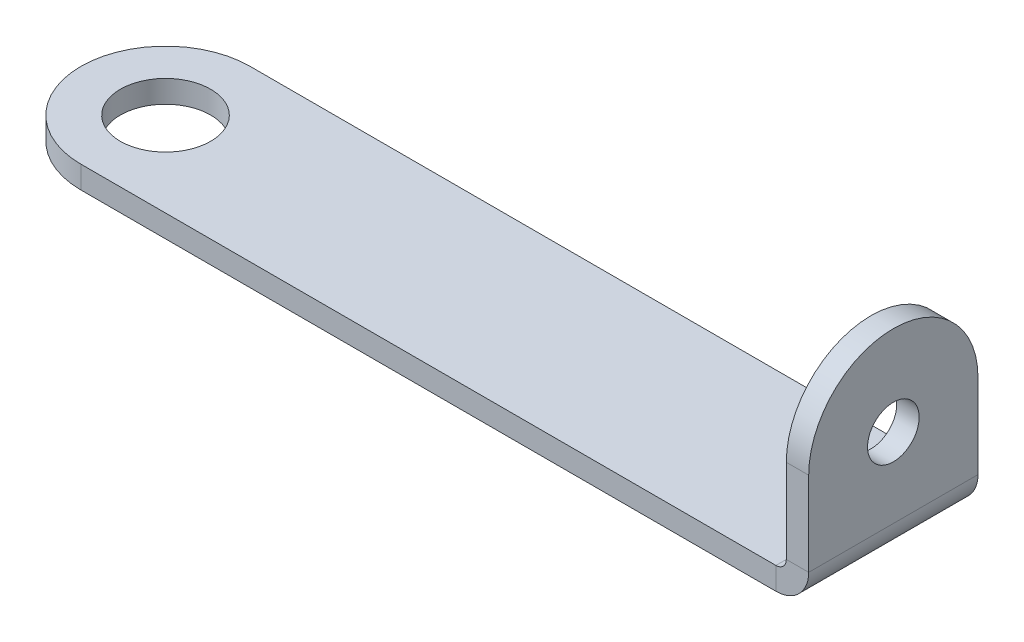
ISO-10303-21;
HEADER;
FILE_DESCRIPTION(('STEP AP214'),'2;1');
FILE_NAME('part.step','',(''),(''),'','','');
FILE_SCHEMA(('AUTOMOTIVE_DESIGN { 1 0 10303 214 1 1 1 1 }'));
ENDSEC;
DATA;
#1=APPLICATION_CONTEXT('core data for automotive mechanical design processes');
#2=APPLICATION_PROTOCOL_DEFINITION('international standard','automotive_design',2000,#1);
#3=PRODUCT_CONTEXT('',#1,'mechanical');
#4=PRODUCT('Part','Part','',(#3));
#5=PRODUCT_RELATED_PRODUCT_CATEGORY('part','',(#4));
#6=PRODUCT_DEFINITION_FORMATION('','',#4);
#7=PRODUCT_DEFINITION_CONTEXT('part definition',#1,'design');
#8=PRODUCT_DEFINITION('design','',#6,#7);
#9=PRODUCT_DEFINITION_SHAPE('','',#8);
#10=(LENGTH_UNIT() NAMED_UNIT(*) SI_UNIT(.MILLI.,.METRE.));
#11=(NAMED_UNIT(*) PLANE_ANGLE_UNIT() SI_UNIT($,.RADIAN.));
#12=(NAMED_UNIT(*) SI_UNIT($,.STERADIAN.) SOLID_ANGLE_UNIT());
#13=UNCERTAINTY_MEASURE_WITH_UNIT(LENGTH_MEASURE(1.E-05),#10,'distance_accuracy_value','');
#14=(GEOMETRIC_REPRESENTATION_CONTEXT(3) GLOBAL_UNCERTAINTY_ASSIGNED_CONTEXT((#13)) GLOBAL_UNIT_ASSIGNED_CONTEXT((#10,
#11,#12)) REPRESENTATION_CONTEXT('',''));
#15=CARTESIAN_POINT('',(0.,0.,0.));
#16=DIRECTION('',(0.,0.,1.));
#17=DIRECTION('',(1.,0.,0.));
#18=AXIS2_PLACEMENT_3D('',#15,#16,#17);
#19=CARTESIAN_POINT('',(51.5875,8.28749999999999,0.));
#20=DIRECTION('',(-1.,0.,0.));
#21=DIRECTION('',(0.,-1.,0.));
#22=AXIS2_PLACEMENT_3D('',#19,#20,#21);
#23=CYLINDRICAL_SURFACE('',#22,6.);
#24=DIRECTION('',(-1.,0.,0.));
#25=VECTOR('',#24,1.);
#26=CARTESIAN_POINT('',(51.5875,8.28749999999999,6.));
#27=LINE('',#26,#25);
#28=CARTESIAN_POINT('',(51.5875,8.28749999999999,6.));
#29=VERTEX_POINT('',#28);
#30=CARTESIAN_POINT('',(50.,8.2875,6.));
#31=VERTEX_POINT('',#30);
#32=EDGE_CURVE('E188',#29,#31,#27,.T.);
#33=ORIENTED_EDGE('',*,*,#32,.F.);
#34=CARTESIAN_POINT('',(51.5875,8.28749999999999,0.));
#35=DIRECTION('',(-1.,0.,0.));
#36=DIRECTION('',(0.,-1.,0.));
#37=AXIS2_PLACEMENT_3D('',#34,#35,#36);
#38=CIRCLE('',#37,6.);
#39=CARTESIAN_POINT('',(51.5875,8.28749999999999,-6.));
#40=VERTEX_POINT('',#39);
#41=EDGE_CURVE('E49',#40,#29,#38,.F.);
#42=ORIENTED_EDGE('',*,*,#41,.F.);
#43=DIRECTION('',(-1.,0.,0.));
#44=VECTOR('',#43,1.);
#45=CARTESIAN_POINT('',(51.5875,8.28749999999999,-6.));
#46=LINE('',#45,#44);
#47=CARTESIAN_POINT('',(50.,8.2875,-6.));
#48=VERTEX_POINT('',#47);
#49=EDGE_CURVE('E137',#48,#40,#46,.F.);
#50=ORIENTED_EDGE('',*,*,#49,.F.);
#51=CARTESIAN_POINT('',(50.,8.2875,0.));
#52=DIRECTION('',(-1.,0.,0.));
#53=DIRECTION('',(0.,-1.,0.));
#54=AXIS2_PLACEMENT_3D('',#51,#52,#53);
#55=CIRCLE('',#54,6.);
#56=EDGE_CURVE('E11',#31,#48,#55,.T.);
#57=ORIENTED_EDGE('',*,*,#56,.F.);
#58=EDGE_LOOP('',(#33,#42,#50,#57));
#59=FACE_BOUND('',#58,.T.);
#60=ADVANCED_FACE('F41',(#59),#23,.T.);
#61=CARTESIAN_POINT('',(0.,1.5875,0.));
#62=DIRECTION('',(0.,1.,0.));
#63=DIRECTION('',(0.,0.,1.));
#64=AXIS2_PLACEMENT_3D('',#61,#62,#63);
#65=PLANE('',#64);
#66=CARTESIAN_POINT('',(0.,1.5875,0.));
#67=DIRECTION('',(0.,1.,0.));
#68=DIRECTION('',(0.,0.,1.));
#69=AXIS2_PLACEMENT_3D('',#66,#67,#68);
#70=CIRCLE('',#69,3.19999999999999);
#71=CARTESIAN_POINT('',(0.,1.5875,3.19999999999999));
#72=VERTEX_POINT('',#71);
#73=EDGE_CURVE('E161',#72,#72,#70,.T.);
#74=ORIENTED_EDGE('',*,*,#73,.F.);
#75=EDGE_LOOP('',(#74));
#76=FACE_BOUND('',#75,.T.);
#77=DIRECTION('',(1.,0.,0.));
#78=VECTOR('',#77,1.);
#79=CARTESIAN_POINT('',(0.,1.5875,6.));
#80=LINE('',#79,#78);
#81=CARTESIAN_POINT('',(0.,1.5875,6.));
#82=VERTEX_POINT('',#81);
#83=CARTESIAN_POINT('',(49.2634,1.5875,6.));
#84=VERTEX_POINT('',#83);
#85=EDGE_CURVE('E170',#82,#84,#80,.T.);
#86=ORIENTED_EDGE('',*,*,#85,.T.);
#87=DIRECTION('',(0.,0.,-1.));
#88=VECTOR('',#87,1.);
#89=CARTESIAN_POINT('',(49.2634,1.5875,-6.));
#90=LINE('',#89,#88);
#91=CARTESIAN_POINT('',(49.2634,1.5875,-6.));
#92=VERTEX_POINT('',#91);
#93=EDGE_CURVE('E151',#92,#84,#90,.F.);
#94=ORIENTED_EDGE('',*,*,#93,.F.);
#95=DIRECTION('',(-1.,0.,0.));
#96=VECTOR('',#95,1.);
#97=CARTESIAN_POINT('',(0.,1.5875,-6.));
#98=LINE('',#97,#96);
#99=CARTESIAN_POINT('',(0.,1.5875,-6.));
#100=VERTEX_POINT('',#99);
#101=EDGE_CURVE('E174',#92,#100,#98,.T.);
#102=ORIENTED_EDGE('',*,*,#101,.T.);
#103=CARTESIAN_POINT('',(0.,1.5875,0.));
#104=DIRECTION('',(0.,1.,0.));
#105=DIRECTION('',(0.,0.,1.));
#106=AXIS2_PLACEMENT_3D('',#103,#104,#105);
#107=CIRCLE('',#106,6.);
#108=EDGE_CURVE('E167',#100,#82,#107,.T.);
#109=ORIENTED_EDGE('',*,*,#108,.T.);
#110=EDGE_LOOP('',(#86,#94,#102,#109));
#111=FACE_BOUND('',#110,.T.);
#112=ADVANCED_FACE('F220',(#76,#111),#65,.T.);
#113=CARTESIAN_POINT('',(0.,0.,0.));
#114=DIRECTION('',(0.,1.,0.));
#115=DIRECTION('',(0.,0.,1.));
#116=AXIS2_PLACEMENT_3D('',#113,#114,#115);
#117=PLANE('',#116);
#118=CARTESIAN_POINT('',(0.,0.,0.));
#119=DIRECTION('',(0.,1.,0.));
#120=DIRECTION('',(0.,0.,1.));
#121=AXIS2_PLACEMENT_3D('',#118,#119,#120);
#122=CIRCLE('',#121,3.19999999999999);
#123=CARTESIAN_POINT('',(0.,0.,3.19999999999999));
#124=VERTEX_POINT('',#123);
#125=EDGE_CURVE('E158',#124,#124,#122,.T.);
#126=ORIENTED_EDGE('',*,*,#125,.T.);
#127=EDGE_LOOP('',(#126));
#128=FACE_BOUND('',#127,.T.);
#129=DIRECTION('',(0.,0.,-1.));
#130=VECTOR('',#129,1.);
#131=CARTESIAN_POINT('',(49.2634,0.,-6.));
#132=LINE('',#131,#130);
#133=CARTESIAN_POINT('',(49.2634,0.,-6.));
#134=VERTEX_POINT('',#133);
#135=CARTESIAN_POINT('',(49.2634,0.,6.));
#136=VERTEX_POINT('',#135);
#137=EDGE_CURVE('E112',#134,#136,#132,.F.);
#138=ORIENTED_EDGE('',*,*,#137,.T.);
#139=DIRECTION('',(1.,0.,0.));
#140=VECTOR('',#139,1.);
#141=CARTESIAN_POINT('',(0.,0.,6.));
#142=LINE('',#141,#140);
#143=CARTESIAN_POINT('',(0.,0.,6.));
#144=VERTEX_POINT('',#143);
#145=EDGE_CURVE('E179',#144,#136,#142,.T.);
#146=ORIENTED_EDGE('',*,*,#145,.F.);
#147=CARTESIAN_POINT('',(0.,0.,0.));
#148=DIRECTION('',(0.,1.,0.));
#149=DIRECTION('',(0.,0.,1.));
#150=AXIS2_PLACEMENT_3D('',#147,#148,#149);
#151=CIRCLE('',#150,6.);
#152=CARTESIAN_POINT('',(0.,0.,-6.));
#153=VERTEX_POINT('',#152);
#154=EDGE_CURVE('E164',#153,#144,#151,.T.);
#155=ORIENTED_EDGE('',*,*,#154,.F.);
#156=DIRECTION('',(-1.,0.,0.));
#157=VECTOR('',#156,1.);
#158=CARTESIAN_POINT('',(0.,0.,-6.));
#159=LINE('',#158,#157);
#160=EDGE_CURVE('E171',#134,#153,#159,.T.);
#161=ORIENTED_EDGE('',*,*,#160,.F.);
#162=EDGE_LOOP('',(#138,#146,#155,#161));
#163=FACE_BOUND('',#162,.T.);
#164=ADVANCED_FACE('F228',(#128,#163),#117,.F.);
#165=CARTESIAN_POINT('',(0.,1.5875,6.));
#166=DIRECTION('',(0.,0.,-1.));
#167=DIRECTION('',(-1.,0.,0.));
#168=AXIS2_PLACEMENT_3D('',#165,#166,#167);
#169=PLANE('',#168);
#170=DIRECTION('',(0.,-1.,0.));
#171=VECTOR('',#170,1.);
#172=CARTESIAN_POINT('',(49.2634,1.5875,6.));
#173=LINE('',#172,#171);
#174=EDGE_CURVE('E155',#84,#136,#173,.T.);
#175=ORIENTED_EDGE('',*,*,#174,.F.);
#176=ORIENTED_EDGE('',*,*,#85,.F.);
#177=DIRECTION('',(0.,-1.,0.));
#178=VECTOR('',#177,1.);
#179=CARTESIAN_POINT('',(0.,1.5875,6.));
#180=LINE('',#179,#178);
#181=EDGE_CURVE('E185',#82,#144,#180,.T.);
#182=ORIENTED_EDGE('',*,*,#181,.T.);
#183=ORIENTED_EDGE('',*,*,#145,.T.);
#184=EDGE_LOOP('',(#175,#176,#182,#183));
#185=FACE_BOUND('',#184,.T.);
#186=ADVANCED_FACE('F218',(#185),#169,.F.);
#187=CARTESIAN_POINT('',(0.,1.5875,-6.));
#188=DIRECTION('',(0.,0.,1.));
#189=DIRECTION('',(1.,0.,0.));
#190=AXIS2_PLACEMENT_3D('',#187,#188,#189);
#191=PLANE('',#190);
#192=DIRECTION('',(0.,-1.,0.));
#193=VECTOR('',#192,1.);
#194=CARTESIAN_POINT('',(49.2634,1.5875,-6.));
#195=LINE('',#194,#193);
#196=EDGE_CURVE('E147',#92,#134,#195,.T.);
#197=ORIENTED_EDGE('',*,*,#196,.T.);
#198=ORIENTED_EDGE('',*,*,#160,.T.);
#199=DIRECTION('',(0.,-1.,0.));
#200=VECTOR('',#199,1.);
#201=CARTESIAN_POINT('',(0.,1.5875,-6.));
#202=LINE('',#201,#200);
#203=EDGE_CURVE('E176',#100,#153,#202,.T.);
#204=ORIENTED_EDGE('',*,*,#203,.F.);
#205=ORIENTED_EDGE('',*,*,#101,.F.);
#206=EDGE_LOOP('',(#197,#198,#204,#205));
#207=FACE_BOUND('',#206,.T.);
#208=ADVANCED_FACE('F230',(#207),#191,.F.);
#209=CARTESIAN_POINT('',(0.,1.5875,0.));
#210=DIRECTION('',(0.,-1.,0.));
#211=DIRECTION('',(0.,0.,-1.));
#212=AXIS2_PLACEMENT_3D('',#209,#210,#211);
#213=CYLINDRICAL_SURFACE('',#212,6.);
#214=ORIENTED_EDGE('',*,*,#154,.T.);
#215=ORIENTED_EDGE('',*,*,#181,.F.);
#216=ORIENTED_EDGE('',*,*,#108,.F.);
#217=ORIENTED_EDGE('',*,*,#203,.T.);
#218=EDGE_LOOP('',(#214,#215,#216,#217));
#219=FACE_BOUND('',#218,.T.);
#220=ADVANCED_FACE('F225',(#219),#213,.T.);
#221=CARTESIAN_POINT('',(0.,1.5875,0.));
#222=DIRECTION('',(0.,-1.,0.));
#223=DIRECTION('',(0.,0.,-1.));
#224=AXIS2_PLACEMENT_3D('',#221,#222,#223);
#225=CYLINDRICAL_SURFACE('',#224,3.19999999999999);
#226=ORIENTED_EDGE('',*,*,#73,.T.);
#227=EDGE_LOOP('',(#226));
#228=FACE_BOUND('',#227,.T.);
#229=ORIENTED_EDGE('',*,*,#125,.F.);
#230=EDGE_LOOP('',(#229));
#231=FACE_BOUND('',#230,.T.);
#232=ADVANCED_FACE('F237',(#228,#231),#225,.F.);
#233=CARTESIAN_POINT('',(49.2634,2.3241,6.));
#234=DIRECTION('',(0.,0.,1.));
#235=DIRECTION('',(1.,0.,0.));
#236=AXIS2_PLACEMENT_3D('',#233,#234,#235);
#237=PLANE('',#236);
#238=DIRECTION('',(1.,0.,0.));
#239=VECTOR('',#238,1.);
#240=CARTESIAN_POINT('',(50.,2.3241,6.));
#241=LINE('',#240,#239);
#242=CARTESIAN_POINT('',(50.,2.3241,6.));
#243=VERTEX_POINT('',#242);
#244=CARTESIAN_POINT('',(51.5875,2.32409999999999,5.99999999999999));
#245=VERTEX_POINT('',#244);
#246=EDGE_CURVE('E195',#243,#245,#241,.T.);
#247=ORIENTED_EDGE('',*,*,#246,.F.);
#248=CARTESIAN_POINT('',(49.2634,2.3241,6.));
#249=DIRECTION('',(0.,0.,-1.));
#250=DIRECTION('',(-1.,0.,0.));
#251=AXIS2_PLACEMENT_3D('',#248,#249,#250);
#252=CIRCLE('',#251,0.736599999999997);
#253=EDGE_CURVE('E115',#84,#243,#252,.F.);
#254=ORIENTED_EDGE('',*,*,#253,.F.);
#255=ORIENTED_EDGE('',*,*,#174,.T.);
#256=CARTESIAN_POINT('',(49.2634,2.3241,5.99999999999999));
#257=DIRECTION('',(0.,0.,-1.));
#258=DIRECTION('',(-1.,0.,0.));
#259=AXIS2_PLACEMENT_3D('',#256,#257,#258);
#260=CIRCLE('',#259,2.3241);
#261=EDGE_CURVE('E146',#136,#245,#260,.F.);
#262=ORIENTED_EDGE('',*,*,#261,.T.);
#263=EDGE_LOOP('',(#247,#254,#255,#262));
#264=FACE_BOUND('',#263,.T.);
#265=ADVANCED_FACE('F216',(#264),#237,.T.);
#266=CARTESIAN_POINT('',(49.2634,2.3241,-6.));
#267=DIRECTION('',(0.,0.,1.));
#268=DIRECTION('',(1.,0.,0.));
#269=AXIS2_PLACEMENT_3D('',#266,#267,#268);
#270=PLANE('',#269);
#271=CARTESIAN_POINT('',(49.2634,2.3241,-6.));
#272=DIRECTION('',(0.,0.,-1.));
#273=DIRECTION('',(-1.,0.,0.));
#274=AXIS2_PLACEMENT_3D('',#271,#272,#273);
#275=CIRCLE('',#274,0.736599999999997);
#276=CARTESIAN_POINT('',(50.,2.3241,-6.));
#277=VERTEX_POINT('',#276);
#278=EDGE_CURVE('E122',#277,#92,#275,.T.);
#279=ORIENTED_EDGE('',*,*,#278,.F.);
#280=DIRECTION('',(1.,0.,0.));
#281=VECTOR('',#280,1.);
#282=CARTESIAN_POINT('',(50.,2.3241,-6.));
#283=LINE('',#282,#281);
#284=CARTESIAN_POINT('',(51.5875,2.32409999999999,-6.));
#285=VERTEX_POINT('',#284);
#286=EDGE_CURVE('E119',#277,#285,#283,.T.);
#287=ORIENTED_EDGE('',*,*,#286,.T.);
#288=CARTESIAN_POINT('',(49.2634,2.3241,-6.));
#289=DIRECTION('',(0.,0.,-1.));
#290=DIRECTION('',(-1.,0.,0.));
#291=AXIS2_PLACEMENT_3D('',#288,#289,#290);
#292=CIRCLE('',#291,2.3241);
#293=EDGE_CURVE('E105',#285,#134,#292,.T.);
#294=ORIENTED_EDGE('',*,*,#293,.T.);
#295=ORIENTED_EDGE('',*,*,#196,.F.);
#296=EDGE_LOOP('',(#279,#287,#294,#295));
#297=FACE_BOUND('',#296,.T.);
#298=ADVANCED_FACE('F120',(#297),#270,.F.);
#299=CARTESIAN_POINT('',(49.2634,2.3241,-6.));
#300=DIRECTION('',(0.,0.,-1.));
#301=DIRECTION('',(1.,0.,0.));
#302=AXIS2_PLACEMENT_3D('',#299,#300,#301);
#303=CYLINDRICAL_SURFACE('',#302,2.3241);
#304=ORIENTED_EDGE('',*,*,#137,.F.);
#305=ORIENTED_EDGE('',*,*,#293,.F.);
#306=DIRECTION('',(0.,0.,1.));
#307=VECTOR('',#306,1.);
#308=CARTESIAN_POINT('',(51.5875,2.32409999999999,0.));
#309=LINE('',#308,#307);
#310=EDGE_CURVE('E110',#285,#245,#309,.T.);
#311=ORIENTED_EDGE('',*,*,#310,.T.);
#312=ORIENTED_EDGE('',*,*,#261,.F.);
#313=EDGE_LOOP('',(#304,#305,#311,#312));
#314=FACE_BOUND('',#313,.T.);
#315=ADVANCED_FACE('F107',(#314),#303,.T.);
#316=CARTESIAN_POINT('',(49.2634,2.3241,-6.));
#317=DIRECTION('',(0.,0.,-1.));
#318=DIRECTION('',(1.,0.,0.));
#319=AXIS2_PLACEMENT_3D('',#316,#317,#318);
#320=CYLINDRICAL_SURFACE('',#319,0.736599999999997);
#321=ORIENTED_EDGE('',*,*,#93,.T.);
#322=ORIENTED_EDGE('',*,*,#253,.T.);
#323=DIRECTION('',(0.,0.,-1.));
#324=VECTOR('',#323,1.);
#325=CARTESIAN_POINT('',(50.,2.3241,6.));
#326=LINE('',#325,#324);
#327=EDGE_CURVE('E126',#243,#277,#326,.T.);
#328=ORIENTED_EDGE('',*,*,#327,.T.);
#329=ORIENTED_EDGE('',*,*,#278,.T.);
#330=EDGE_LOOP('',(#321,#322,#328,#329));
#331=FACE_BOUND('',#330,.T.);
#332=ADVANCED_FACE('F214',(#331),#320,.F.);
#333=CARTESIAN_POINT('',(51.5875,14.2875,-6.));
#334=DIRECTION('',(0.,0.,1.));
#335=DIRECTION('',(1.,0.,0.));
#336=AXIS2_PLACEMENT_3D('',#333,#334,#335);
#337=PLANE('',#336);
#338=DIRECTION('',(0.,1.,0.));
#339=VECTOR('',#338,1.);
#340=CARTESIAN_POINT('',(50.,14.2875,-6.));
#341=LINE('',#340,#339);
#342=EDGE_CURVE('E134',#277,#48,#341,.T.);
#343=ORIENTED_EDGE('',*,*,#342,.T.);
#344=ORIENTED_EDGE('',*,*,#49,.T.);
#345=DIRECTION('',(0.,1.,0.));
#346=VECTOR('',#345,1.);
#347=CARTESIAN_POINT('',(51.5875,14.2875,-6.));
#348=LINE('',#347,#346);
#349=EDGE_CURVE('E131',#285,#40,#348,.T.);
#350=ORIENTED_EDGE('',*,*,#349,.F.);
#351=ORIENTED_EDGE('',*,*,#286,.F.);
#352=EDGE_LOOP('',(#343,#344,#350,#351));
#353=FACE_BOUND('',#352,.T.);
#354=ADVANCED_FACE('F136',(#353),#337,.F.);
#355=CARTESIAN_POINT('',(51.5875,1.58749999999999,6.));
#356=DIRECTION('',(0.,0.,-1.));
#357=DIRECTION('',(-1.,0.,0.));
#358=AXIS2_PLACEMENT_3D('',#355,#356,#357);
#359=PLANE('',#358);
#360=DIRECTION('',(0.,-1.,0.));
#361=VECTOR('',#360,1.);
#362=CARTESIAN_POINT('',(51.5875,1.58749999999999,6.));
#363=LINE('',#362,#361);
#364=EDGE_CURVE('E133',#29,#245,#363,.T.);
#365=ORIENTED_EDGE('',*,*,#364,.F.);
#366=ORIENTED_EDGE('',*,*,#32,.T.);
#367=DIRECTION('',(0.,-1.,0.));
#368=VECTOR('',#367,1.);
#369=CARTESIAN_POINT('',(50.,1.5875,6.));
#370=LINE('',#369,#368);
#371=EDGE_CURVE('E138',#31,#243,#370,.T.);
#372=ORIENTED_EDGE('',*,*,#371,.T.);
#373=ORIENTED_EDGE('',*,*,#246,.T.);
#374=EDGE_LOOP('',(#365,#366,#372,#373));
#375=FACE_BOUND('',#374,.T.);
#376=ADVANCED_FACE('F193',(#375),#359,.F.);
#377=CARTESIAN_POINT('',(51.5875,-1.69453606245269E-13,0.));
#378=DIRECTION('',(-1.,0.,0.));
#379=DIRECTION('',(0.,-1.,0.));
#380=AXIS2_PLACEMENT_3D('',#377,#378,#379);
#381=PLANE('',#380);
#382=CARTESIAN_POINT('',(51.5875000000001,7.93749999999994,0.));
#383=DIRECTION('',(-1.,0.,0.));
#384=DIRECTION('',(0.,-1.,0.));
#385=AXIS2_PLACEMENT_3D('',#382,#383,#384);
#386=CIRCLE('',#385,1.8288);
#387=CARTESIAN_POINT('',(51.5875000000001,6.10869999999994,0.));
#388=VERTEX_POINT('',#387);
#389=EDGE_CURVE('E198',#388,#388,#386,.T.);
#390=ORIENTED_EDGE('',*,*,#389,.T.);
#391=EDGE_LOOP('',(#390));
#392=FACE_BOUND('',#391,.T.);
#393=ORIENTED_EDGE('',*,*,#349,.T.);
#394=ORIENTED_EDGE('',*,*,#41,.T.);
#395=ORIENTED_EDGE('',*,*,#364,.T.);
#396=ORIENTED_EDGE('',*,*,#310,.F.);
#397=EDGE_LOOP('',(#393,#394,#395,#396));
#398=FACE_BOUND('',#397,.T.);
#399=ADVANCED_FACE('F130',(#392,#398),#381,.F.);
#400=CARTESIAN_POINT('',(50.,-1.63910879619856E-13,0.));
#401=DIRECTION('',(-1.,0.,0.));
#402=DIRECTION('',(0.,-1.,0.));
#403=AXIS2_PLACEMENT_3D('',#400,#401,#402);
#404=PLANE('',#403);
#405=CARTESIAN_POINT('',(50.,7.93749999999994,0.));
#406=DIRECTION('',(-1.,0.,0.));
#407=DIRECTION('',(0.,-1.,0.));
#408=AXIS2_PLACEMENT_3D('',#405,#406,#407);
#409=CIRCLE('',#408,1.8288);
#410=CARTESIAN_POINT('',(50.,6.10869999999994,0.));
#411=VERTEX_POINT('',#410);
#412=EDGE_CURVE('E201',#411,#411,#409,.T.);
#413=ORIENTED_EDGE('',*,*,#412,.F.);
#414=EDGE_LOOP('',(#413));
#415=FACE_BOUND('',#414,.T.);
#416=ORIENTED_EDGE('',*,*,#371,.F.);
#417=ORIENTED_EDGE('',*,*,#56,.T.);
#418=ORIENTED_EDGE('',*,*,#342,.F.);
#419=ORIENTED_EDGE('',*,*,#327,.F.);
#420=EDGE_LOOP('',(#416,#417,#418,#419));
#421=FACE_BOUND('',#420,.T.);
#422=ADVANCED_FACE('F209',(#415,#421),#404,.T.);
#423=CARTESIAN_POINT('',(51.5875000000001,7.93749999999994,0.));
#424=DIRECTION('',(-1.,0.,0.));
#425=DIRECTION('',(0.,-1.,0.));
#426=AXIS2_PLACEMENT_3D('',#423,#424,#425);
#427=CYLINDRICAL_SURFACE('',#426,1.8288);
#428=ORIENTED_EDGE('',*,*,#389,.F.);
#429=EDGE_LOOP('',(#428));
#430=FACE_BOUND('',#429,.T.);
#431=ORIENTED_EDGE('',*,*,#412,.T.);
#432=EDGE_LOOP('',(#431));
#433=FACE_BOUND('',#432,.T.);
#434=ADVANCED_FACE('F207',(#430,#433),#427,.F.);
#435=CLOSED_SHELL('',(#60,#112,#164,#186,#208,#220,#232,#265,#298,#315,#332,#354,#376,#399,#422,#434));
#436=MANIFOLD_SOLID_BREP('B2',#435);
#437=ADVANCED_BREP_SHAPE_REPRESENTATION('',(#18,#436),#14);
#438=SHAPE_DEFINITION_REPRESENTATION(#9,#437);
ENDSEC;
END-ISO-10303-21;
